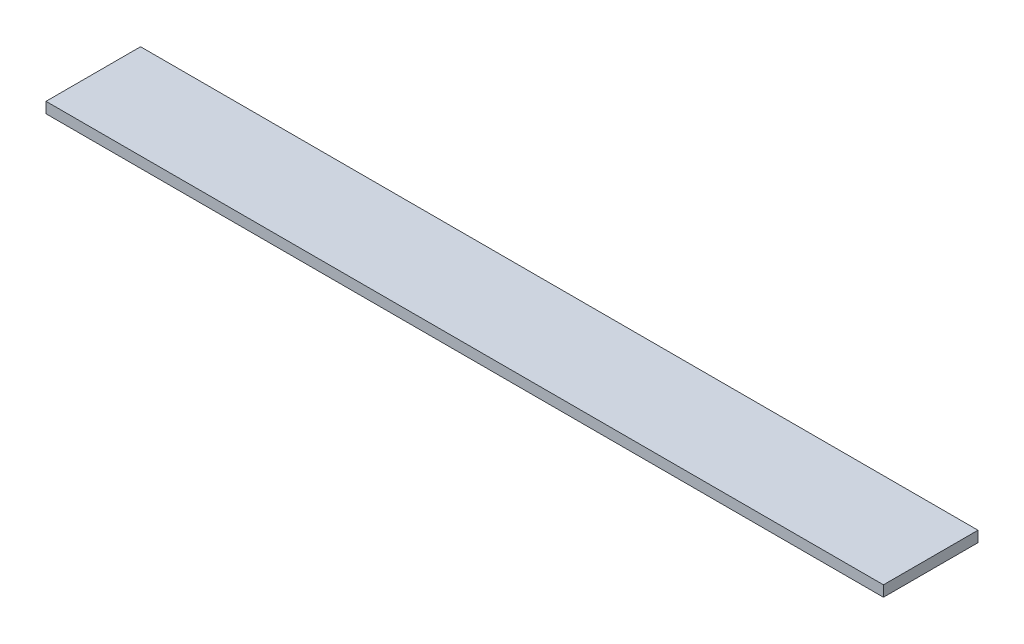
ISO-10303-21;
HEADER;
FILE_DESCRIPTION(('STEP AP214'),'2;1');
FILE_NAME('part.step','',(''),(''),'','','');
FILE_SCHEMA(('AUTOMOTIVE_DESIGN { 1 0 10303 214 1 1 1 1 }'));
ENDSEC;
DATA;
#1=APPLICATION_CONTEXT('core data for automotive mechanical design processes');
#2=APPLICATION_PROTOCOL_DEFINITION('international standard','automotive_design',2000,#1);
#3=PRODUCT_CONTEXT('',#1,'mechanical');
#4=PRODUCT('Part','Part','',(#3));
#5=PRODUCT_RELATED_PRODUCT_CATEGORY('part','',(#4));
#6=PRODUCT_DEFINITION_FORMATION('','',#4);
#7=PRODUCT_DEFINITION_CONTEXT('part definition',#1,'design');
#8=PRODUCT_DEFINITION('design','',#6,#7);
#9=PRODUCT_DEFINITION_SHAPE('','',#8);
#10=(LENGTH_UNIT() NAMED_UNIT(*) SI_UNIT(.MILLI.,.METRE.));
#11=(NAMED_UNIT(*) PLANE_ANGLE_UNIT() SI_UNIT($,.RADIAN.));
#12=(NAMED_UNIT(*) SI_UNIT($,.STERADIAN.) SOLID_ANGLE_UNIT());
#13=UNCERTAINTY_MEASURE_WITH_UNIT(LENGTH_MEASURE(1.E-05),#10,'distance_accuracy_value','');
#14=(GEOMETRIC_REPRESENTATION_CONTEXT(3) GLOBAL_UNCERTAINTY_ASSIGNED_CONTEXT((#13)) GLOBAL_UNIT_ASSIGNED_CONTEXT((#10,
#11,#12)) REPRESENTATION_CONTEXT('',''));
#15=CARTESIAN_POINT('',(0.,0.,0.));
#16=DIRECTION('',(0.,0.,1.));
#17=DIRECTION('',(1.,0.,0.));
#18=AXIS2_PLACEMENT_3D('',#15,#16,#17);
#19=CARTESIAN_POINT('',(155.,4.,-17.5));
#20=DIRECTION('',(-1.,0.,0.));
#21=DIRECTION('',(0.,0.,1.));
#22=AXIS2_PLACEMENT_3D('',#19,#20,#21);
#23=PLANE('',#22);
#24=DIRECTION('',(0.,0.,-1.));
#25=VECTOR('',#24,1.);
#26=CARTESIAN_POINT('',(155.,0.,-17.5));
#27=LINE('',#26,#25);
#28=CARTESIAN_POINT('',(155.,0.,17.5));
#29=VERTEX_POINT('',#28);
#30=CARTESIAN_POINT('',(155.,0.,-17.5));
#31=VERTEX_POINT('',#30);
#32=EDGE_CURVE('E102',#29,#31,#27,.T.);
#33=ORIENTED_EDGE('',*,*,#32,.T.);
#34=DIRECTION('',(0.,-1.,0.));
#35=VECTOR('',#34,1.);
#36=CARTESIAN_POINT('',(155.,4.,-17.5));
#37=LINE('',#36,#35);
#38=CARTESIAN_POINT('',(155.,4.,-17.5));
#39=VERTEX_POINT('',#38);
#40=EDGE_CURVE('E11',#39,#31,#37,.T.);
#41=ORIENTED_EDGE('',*,*,#40,.F.);
#42=DIRECTION('',(0.,0.,-1.));
#43=VECTOR('',#42,1.);
#44=CARTESIAN_POINT('',(155.,4.,-17.5));
#45=LINE('',#44,#43);
#46=CARTESIAN_POINT('',(155.,4.,17.5));
#47=VERTEX_POINT('',#46);
#48=EDGE_CURVE('E90',#47,#39,#45,.T.);
#49=ORIENTED_EDGE('',*,*,#48,.F.);
#50=DIRECTION('',(0.,-1.,0.));
#51=VECTOR('',#50,1.);
#52=CARTESIAN_POINT('',(155.,4.,17.5));
#53=LINE('',#52,#51);
#54=EDGE_CURVE('E98',#47,#29,#53,.T.);
#55=ORIENTED_EDGE('',*,*,#54,.T.);
#56=EDGE_LOOP('',(#33,#41,#49,#55));
#57=FACE_BOUND('',#56,.T.);
#58=ADVANCED_FACE('F39',(#57),#23,.F.);
#59=CARTESIAN_POINT('',(-155.,4.,-17.5));
#60=DIRECTION('',(0.,0.,1.));
#61=DIRECTION('',(1.,0.,0.));
#62=AXIS2_PLACEMENT_3D('',#59,#60,#61);
#63=PLANE('',#62);
#64=DIRECTION('',(-1.,0.,0.));
#65=VECTOR('',#64,1.);
#66=CARTESIAN_POINT('',(-155.,0.,-17.5));
#67=LINE('',#66,#65);
#68=CARTESIAN_POINT('',(-155.,0.,-17.5));
#69=VERTEX_POINT('',#68);
#70=EDGE_CURVE('E94',#31,#69,#67,.T.);
#71=ORIENTED_EDGE('',*,*,#70,.T.);
#72=DIRECTION('',(0.,-1.,0.));
#73=VECTOR('',#72,1.);
#74=CARTESIAN_POINT('',(-155.,4.,-17.5));
#75=LINE('',#74,#73);
#76=CARTESIAN_POINT('',(-155.,4.,-17.5));
#77=VERTEX_POINT('',#76);
#78=EDGE_CURVE('E47',#77,#69,#75,.T.);
#79=ORIENTED_EDGE('',*,*,#78,.F.);
#80=DIRECTION('',(-1.,0.,0.));
#81=VECTOR('',#80,1.);
#82=CARTESIAN_POINT('',(-155.,4.,-17.5));
#83=LINE('',#82,#81);
#84=EDGE_CURVE('E85',#39,#77,#83,.T.);
#85=ORIENTED_EDGE('',*,*,#84,.F.);
#86=ORIENTED_EDGE('',*,*,#40,.T.);
#87=EDGE_LOOP('',(#71,#79,#85,#86));
#88=FACE_BOUND('',#87,.T.);
#89=ADVANCED_FACE('F93',(#88),#63,.F.);
#90=CARTESIAN_POINT('',(-155.,4.,-17.5));
#91=DIRECTION('',(1.,0.,0.));
#92=DIRECTION('',(0.,0.,-1.));
#93=AXIS2_PLACEMENT_3D('',#90,#91,#92);
#94=PLANE('',#93);
#95=DIRECTION('',(0.,0.,1.));
#96=VECTOR('',#95,1.);
#97=CARTESIAN_POINT('',(-155.,0.,-17.5));
#98=LINE('',#97,#96);
#99=CARTESIAN_POINT('',(-155.,0.,17.5));
#100=VERTEX_POINT('',#99);
#101=EDGE_CURVE('E72',#69,#100,#98,.T.);
#102=ORIENTED_EDGE('',*,*,#101,.T.);
#103=DIRECTION('',(0.,-1.,0.));
#104=VECTOR('',#103,1.);
#105=CARTESIAN_POINT('',(-155.,4.,17.5));
#106=LINE('',#105,#104);
#107=CARTESIAN_POINT('',(-155.,4.,17.5));
#108=VERTEX_POINT('',#107);
#109=EDGE_CURVE('E95',#108,#100,#106,.T.);
#110=ORIENTED_EDGE('',*,*,#109,.F.);
#111=DIRECTION('',(0.,0.,1.));
#112=VECTOR('',#111,1.);
#113=CARTESIAN_POINT('',(-155.,4.,-17.5));
#114=LINE('',#113,#112);
#115=EDGE_CURVE('E88',#77,#108,#114,.T.);
#116=ORIENTED_EDGE('',*,*,#115,.F.);
#117=ORIENTED_EDGE('',*,*,#78,.T.);
#118=EDGE_LOOP('',(#102,#110,#116,#117));
#119=FACE_BOUND('',#118,.T.);
#120=ADVANCED_FACE('F96',(#119),#94,.F.);
#121=CARTESIAN_POINT('',(-155.,4.,17.5));
#122=DIRECTION('',(0.,0.,-1.));
#123=DIRECTION('',(-1.,0.,0.));
#124=AXIS2_PLACEMENT_3D('',#121,#122,#123);
#125=PLANE('',#124);
#126=DIRECTION('',(1.,0.,0.));
#127=VECTOR('',#126,1.);
#128=CARTESIAN_POINT('',(-155.,0.,17.5));
#129=LINE('',#128,#127);
#130=EDGE_CURVE('E78',#100,#29,#129,.T.);
#131=ORIENTED_EDGE('',*,*,#130,.T.);
#132=ORIENTED_EDGE('',*,*,#54,.F.);
#133=DIRECTION('',(1.,0.,0.));
#134=VECTOR('',#133,1.);
#135=CARTESIAN_POINT('',(-155.,4.,17.5));
#136=LINE('',#135,#134);
#137=EDGE_CURVE('E55',#108,#47,#136,.T.);
#138=ORIENTED_EDGE('',*,*,#137,.F.);
#139=ORIENTED_EDGE('',*,*,#109,.T.);
#140=EDGE_LOOP('',(#131,#132,#138,#139));
#141=FACE_BOUND('',#140,.T.);
#142=ADVANCED_FACE('F109',(#141),#125,.F.);
#143=CARTESIAN_POINT('',(0.,4.,0.));
#144=DIRECTION('',(0.,1.,0.));
#145=DIRECTION('',(0.,0.,1.));
#146=AXIS2_PLACEMENT_3D('',#143,#144,#145);
#147=PLANE('',#146);
#148=ORIENTED_EDGE('',*,*,#48,.T.);
#149=ORIENTED_EDGE('',*,*,#84,.T.);
#150=ORIENTED_EDGE('',*,*,#115,.T.);
#151=ORIENTED_EDGE('',*,*,#137,.T.);
#152=EDGE_LOOP('',(#148,#149,#150,#151));
#153=FACE_BOUND('',#152,.T.);
#154=ADVANCED_FACE('F86',(#153),#147,.T.);
#155=CARTESIAN_POINT('',(0.,0.,0.));
#156=DIRECTION('',(0.,1.,0.));
#157=DIRECTION('',(0.,0.,1.));
#158=AXIS2_PLACEMENT_3D('',#155,#156,#157);
#159=PLANE('',#158);
#160=ORIENTED_EDGE('',*,*,#32,.F.);
#161=ORIENTED_EDGE('',*,*,#130,.F.);
#162=ORIENTED_EDGE('',*,*,#101,.F.);
#163=ORIENTED_EDGE('',*,*,#70,.F.);
#164=EDGE_LOOP('',(#160,#161,#162,#163));
#165=FACE_BOUND('',#164,.T.);
#166=ADVANCED_FACE('F112',(#165),#159,.F.);
#167=CLOSED_SHELL('',(#58,#89,#120,#142,#154,#166));
#168=MANIFOLD_SOLID_BREP('B2',#167);
#169=ADVANCED_BREP_SHAPE_REPRESENTATION('',(#18,#168),#14);
#170=SHAPE_DEFINITION_REPRESENTATION(#9,#169);
ENDSEC;
END-ISO-10303-21;
